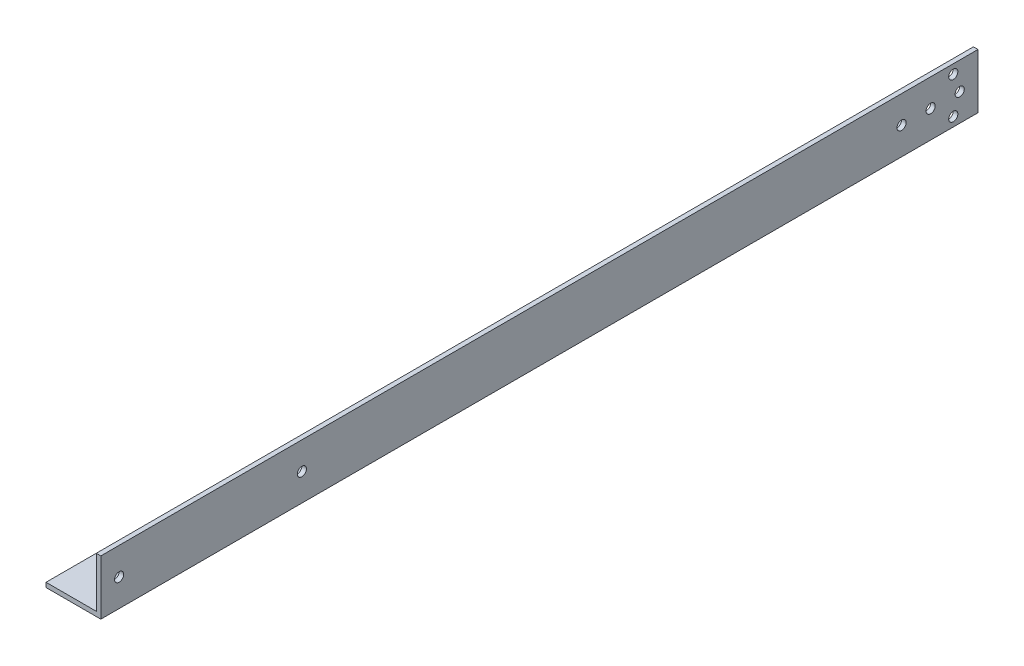
ISO-10303-21;
HEADER;
FILE_DESCRIPTION(('STEP AP214'),'2;1');
FILE_NAME('part.step','',(''),(''),'','','');
FILE_SCHEMA(('AUTOMOTIVE_DESIGN { 1 0 10303 214 1 1 1 1 }'));
ENDSEC;
DATA;
#1=APPLICATION_CONTEXT('core data for automotive mechanical design processes');
#2=APPLICATION_PROTOCOL_DEFINITION('international standard','automotive_design',2000,#1);
#3=PRODUCT_CONTEXT('',#1,'mechanical');
#4=PRODUCT('Part','Part','',(#3));
#5=PRODUCT_RELATED_PRODUCT_CATEGORY('part','',(#4));
#6=PRODUCT_DEFINITION_FORMATION('','',#4);
#7=PRODUCT_DEFINITION_CONTEXT('part definition',#1,'design');
#8=PRODUCT_DEFINITION('design','',#6,#7);
#9=PRODUCT_DEFINITION_SHAPE('','',#8);
#10=(LENGTH_UNIT() NAMED_UNIT(*) SI_UNIT(.MILLI.,.METRE.));
#11=(NAMED_UNIT(*) PLANE_ANGLE_UNIT() SI_UNIT($,.RADIAN.));
#12=(NAMED_UNIT(*) SI_UNIT($,.STERADIAN.) SOLID_ANGLE_UNIT());
#13=UNCERTAINTY_MEASURE_WITH_UNIT(LENGTH_MEASURE(1.E-05),#10,'distance_accuracy_value','');
#14=(GEOMETRIC_REPRESENTATION_CONTEXT(3) GLOBAL_UNCERTAINTY_ASSIGNED_CONTEXT((#13)) GLOBAL_UNIT_ASSIGNED_CONTEXT((#10,
#11,#12)) REPRESENTATION_CONTEXT('',''));
#15=CARTESIAN_POINT('',(0.,0.,0.));
#16=DIRECTION('',(0.,0.,1.));
#17=DIRECTION('',(1.,0.,0.));
#18=AXIS2_PLACEMENT_3D('',#15,#16,#17);
#19=CARTESIAN_POINT('',(-19.05,0.,304.8));
#20=DIRECTION('',(0.,1.,0.));
#21=DIRECTION('',(0.,0.,1.));
#22=AXIS2_PLACEMENT_3D('',#19,#20,#21);
#23=PLANE('',#22);
#24=DIRECTION('',(0.,0.,1.));
#25=VECTOR('',#24,1.);
#26=CARTESIAN_POINT('',(-1.5875,0.,0.));
#27=LINE('',#26,#25);
#28=CARTESIAN_POINT('',(-1.5875,0.,0.));
#29=VERTEX_POINT('',#28);
#30=CARTESIAN_POINT('',(-1.5875,0.,11.7700640302674));
#31=VERTEX_POINT('',#30);
#32=EDGE_CURVE('E182',#29,#31,#27,.T.);
#33=ORIENTED_EDGE('',*,*,#32,.F.);
#34=DIRECTION('',(1.,0.,0.));
#35=VECTOR('',#34,1.);
#36=CARTESIAN_POINT('',(-19.05,0.,0.));
#37=LINE('',#36,#35);
#38=CARTESIAN_POINT('',(0.,0.,0.));
#39=VERTEX_POINT('',#38);
#40=EDGE_CURVE('E117',#29,#39,#37,.T.);
#41=ORIENTED_EDGE('',*,*,#40,.T.);
#42=DIRECTION('',(0.,0.,-1.));
#43=VECTOR('',#42,1.);
#44=CARTESIAN_POINT('',(0.,0.,304.8));
#45=LINE('',#44,#43);
#46=CARTESIAN_POINT('',(0.,0.,304.8));
#47=VERTEX_POINT('',#46);
#48=EDGE_CURVE('E11',#47,#39,#45,.T.);
#49=ORIENTED_EDGE('',*,*,#48,.F.);
#50=DIRECTION('',(1.,0.,0.));
#51=VECTOR('',#50,1.);
#52=CARTESIAN_POINT('',(-19.05,0.,304.8));
#53=LINE('',#52,#51);
#54=CARTESIAN_POINT('',(-19.05,0.,304.8));
#55=VERTEX_POINT('',#54);
#56=EDGE_CURVE('E125',#55,#47,#53,.T.);
#57=ORIENTED_EDGE('',*,*,#56,.F.);
#58=DIRECTION('',(0.,0.,-1.));
#59=VECTOR('',#58,1.);
#60=CARTESIAN_POINT('',(-19.05,0.,304.8));
#61=LINE('',#60,#59);
#62=CARTESIAN_POINT('',(-19.05,0.,11.7700640302674));
#63=VERTEX_POINT('',#62);
#64=EDGE_CURVE('E113',#55,#63,#61,.T.);
#65=ORIENTED_EDGE('',*,*,#64,.T.);
#66=DIRECTION('',(-1.,0.,0.));
#67=VECTOR('',#66,1.);
#68=CARTESIAN_POINT('',(-1.5875,0.,11.7700640302674));
#69=LINE('',#68,#67);
#70=EDGE_CURVE('E184',#31,#63,#69,.T.);
#71=ORIENTED_EDGE('',*,*,#70,.F.);
#72=EDGE_LOOP('',(#33,#41,#49,#57,#65,#71));
#73=FACE_BOUND('',#72,.T.);
#74=ADVANCED_FACE('F31',(#73),#23,.F.);
#75=CARTESIAN_POINT('',(-1.5875,1.5875,304.8));
#76=DIRECTION('',(0.,-1.,0.));
#77=DIRECTION('',(1.,0.,0.));
#78=AXIS2_PLACEMENT_3D('',#75,#76,#77);
#79=PLANE('',#78);
#80=DIRECTION('',(-1.,0.,0.));
#81=VECTOR('',#80,1.);
#82=CARTESIAN_POINT('',(-1.5875,1.5875,11.7700640302674));
#83=LINE('',#82,#81);
#84=CARTESIAN_POINT('',(-1.5875,1.5875,11.7700640302674));
#85=VERTEX_POINT('',#84);
#86=CARTESIAN_POINT('',(-19.05,1.5875,11.7700640302674));
#87=VERTEX_POINT('',#86);
#88=EDGE_CURVE('E189',#85,#87,#83,.T.);
#89=ORIENTED_EDGE('',*,*,#88,.T.);
#90=DIRECTION('',(0.,0.,-1.));
#91=VECTOR('',#90,1.);
#92=CARTESIAN_POINT('',(-19.05,1.5875,304.8));
#93=LINE('',#92,#91);
#94=CARTESIAN_POINT('',(-19.05,1.5875,304.8));
#95=VERTEX_POINT('',#94);
#96=EDGE_CURVE('E108',#95,#87,#93,.T.);
#97=ORIENTED_EDGE('',*,*,#96,.F.);
#98=DIRECTION('',(-1.,0.,0.));
#99=VECTOR('',#98,1.);
#100=CARTESIAN_POINT('',(-1.5875,1.5875,304.8));
#101=LINE('',#100,#99);
#102=CARTESIAN_POINT('',(-1.5875,1.5875,304.8));
#103=VERTEX_POINT('',#102);
#104=EDGE_CURVE('E90',#103,#95,#101,.T.);
#105=ORIENTED_EDGE('',*,*,#104,.F.);
#106=DIRECTION('',(0.,0.,-1.));
#107=VECTOR('',#106,1.);
#108=CARTESIAN_POINT('',(-1.5875,1.5875,304.8));
#109=LINE('',#108,#107);
#110=EDGE_CURVE('E98',#103,#85,#109,.T.);
#111=ORIENTED_EDGE('',*,*,#110,.T.);
#112=EDGE_LOOP('',(#89,#97,#105,#111));
#113=FACE_BOUND('',#112,.T.);
#114=ADVANCED_FACE('F110',(#113),#79,.F.);
#115=CARTESIAN_POINT('',(-19.05,1.5875,304.8));
#116=DIRECTION('',(1.,0.,0.));
#117=DIRECTION('',(0.,0.,-1.));
#118=AXIS2_PLACEMENT_3D('',#115,#116,#117);
#119=PLANE('',#118);
#120=DIRECTION('',(0.,1.,0.));
#121=VECTOR('',#120,1.);
#122=CARTESIAN_POINT('',(-19.05,0.,11.7700640302674));
#123=LINE('',#122,#121);
#124=EDGE_CURVE('E185',#63,#87,#123,.T.);
#125=ORIENTED_EDGE('',*,*,#124,.F.);
#126=ORIENTED_EDGE('',*,*,#64,.F.);
#127=DIRECTION('',(0.,-1.,0.));
#128=VECTOR('',#127,1.);
#129=CARTESIAN_POINT('',(-19.05,1.5875,304.8));
#130=LINE('',#129,#128);
#131=EDGE_CURVE('E49',#95,#55,#130,.T.);
#132=ORIENTED_EDGE('',*,*,#131,.F.);
#133=ORIENTED_EDGE('',*,*,#96,.T.);
#134=EDGE_LOOP('',(#125,#126,#132,#133));
#135=FACE_BOUND('',#134,.T.);
#136=ADVANCED_FACE('F222',(#135),#119,.F.);
#137=CARTESIAN_POINT('',(0.,0.,0.));
#138=DIRECTION('',(0.,0.,1.));
#139=DIRECTION('',(1.,0.,0.));
#140=AXIS2_PLACEMENT_3D('',#137,#138,#139);
#141=PLANE('',#140);
#142=ORIENTED_EDGE('',*,*,#40,.F.);
#143=DIRECTION('',(0.,-1.,0.));
#144=VECTOR('',#143,1.);
#145=CARTESIAN_POINT('',(-1.5875,19.05,0.));
#146=LINE('',#145,#144);
#147=CARTESIAN_POINT('',(-1.5875,19.05,0.));
#148=VERTEX_POINT('',#147);
#149=EDGE_CURVE('E122',#148,#29,#146,.T.);
#150=ORIENTED_EDGE('',*,*,#149,.F.);
#151=DIRECTION('',(-1.,0.,0.));
#152=VECTOR('',#151,1.);
#153=CARTESIAN_POINT('',(0.,19.05,0.));
#154=LINE('',#153,#152);
#155=CARTESIAN_POINT('',(0.,19.05,0.));
#156=VERTEX_POINT('',#155);
#157=EDGE_CURVE('E70',#156,#148,#154,.T.);
#158=ORIENTED_EDGE('',*,*,#157,.F.);
#159=DIRECTION('',(0.,1.,0.));
#160=VECTOR('',#159,1.);
#161=CARTESIAN_POINT('',(0.,0.,0.));
#162=LINE('',#161,#160);
#163=EDGE_CURVE('E63',#39,#156,#162,.T.);
#164=ORIENTED_EDGE('',*,*,#163,.F.);
#165=EDGE_LOOP('',(#142,#150,#158,#164));
#166=FACE_BOUND('',#165,.T.);
#167=ADVANCED_FACE('F177',(#166),#141,.F.);
#168=CARTESIAN_POINT('',(0.,0.,304.8));
#169=DIRECTION('',(-1.,0.,0.));
#170=DIRECTION('',(0.,0.,1.));
#171=AXIS2_PLACEMENT_3D('',#168,#169,#170);
#172=PLANE('',#171);
#173=CARTESIAN_POINT('',(0.,9.525,6.35));
#174=DIRECTION('',(1.,0.,0.));
#175=DIRECTION('',(0.,0.,-1.));
#176=AXIS2_PLACEMENT_3D('',#173,#174,#175);
#177=CIRCLE('',#176,1.5875);
#178=CARTESIAN_POINT('',(0.,9.525,4.7625));
#179=VERTEX_POINT('',#178);
#180=EDGE_CURVE('E193',#179,#179,#177,.T.);
#181=ORIENTED_EDGE('',*,*,#180,.F.);
#182=EDGE_LOOP('',(#181));
#183=FACE_BOUND('',#182,.T.);
#184=CARTESIAN_POINT('',(0.,3.175,8.59506403026729));
#185=DIRECTION('',(1.,0.,0.));
#186=DIRECTION('',(0.,0.,-1.));
#187=AXIS2_PLACEMENT_3D('',#184,#185,#186);
#188=CIRCLE('',#187,1.5875);
#189=CARTESIAN_POINT('',(0.,3.175,7.00756403026729));
#190=VERTEX_POINT('',#189);
#191=EDGE_CURVE('E152',#190,#190,#188,.T.);
#192=ORIENTED_EDGE('',*,*,#191,.F.);
#193=EDGE_LOOP('',(#192));
#194=FACE_BOUND('',#193,.T.);
#195=CARTESIAN_POINT('',(0.,15.875,8.59506403026729));
#196=DIRECTION('',(1.,0.,0.));
#197=DIRECTION('',(0.,0.,-1.));
#198=AXIS2_PLACEMENT_3D('',#195,#196,#197);
#199=CIRCLE('',#198,1.5875);
#200=CARTESIAN_POINT('',(0.,15.875,7.00756403026729));
#201=VERTEX_POINT('',#200);
#202=EDGE_CURVE('E141',#201,#201,#199,.T.);
#203=ORIENTED_EDGE('',*,*,#202,.F.);
#204=EDGE_LOOP('',(#203));
#205=FACE_BOUND('',#204,.T.);
#206=CARTESIAN_POINT('',(0.,9.525,26.5555762724056));
#207=DIRECTION('',(1.,0.,0.));
#208=DIRECTION('',(0.,0.,-1.));
#209=AXIS2_PLACEMENT_3D('',#206,#207,#208);
#210=CIRCLE('',#209,1.5875);
#211=CARTESIAN_POINT('',(0.,9.525,24.9680762724056));
#212=VERTEX_POINT('',#211);
#213=EDGE_CURVE('E138',#212,#212,#210,.T.);
#214=ORIENTED_EDGE('',*,*,#213,.F.);
#215=EDGE_LOOP('',(#214));
#216=FACE_BOUND('',#215,.T.);
#217=CARTESIAN_POINT('',(0.,9.525,16.4527881362028));
#218=DIRECTION('',(1.,0.,0.));
#219=DIRECTION('',(0.,0.,-1.));
#220=AXIS2_PLACEMENT_3D('',#217,#218,#219);
#221=CIRCLE('',#220,1.5875);
#222=CARTESIAN_POINT('',(0.,9.525,14.8652881362028));
#223=VERTEX_POINT('',#222);
#224=EDGE_CURVE('E135',#223,#223,#221,.T.);
#225=ORIENTED_EDGE('',*,*,#224,.F.);
#226=EDGE_LOOP('',(#225));
#227=FACE_BOUND('',#226,.T.);
#228=CARTESIAN_POINT('',(0.,9.525,234.95));
#229=DIRECTION('',(1.,0.,0.));
#230=DIRECTION('',(0.,0.,-1.));
#231=AXIS2_PLACEMENT_3D('',#228,#229,#230);
#232=CIRCLE('',#231,1.58750000000004);
#233=CARTESIAN_POINT('',(0.,9.525,233.3625));
#234=VERTEX_POINT('',#233);
#235=EDGE_CURVE('E134',#234,#234,#232,.T.);
#236=ORIENTED_EDGE('',*,*,#235,.F.);
#237=EDGE_LOOP('',(#236));
#238=FACE_BOUND('',#237,.T.);
#239=CARTESIAN_POINT('',(0.,9.525,298.45));
#240=DIRECTION('',(1.,0.,0.));
#241=DIRECTION('',(0.,0.,-1.));
#242=AXIS2_PLACEMENT_3D('',#239,#240,#241);
#243=CIRCLE('',#242,1.58750000000004);
#244=CARTESIAN_POINT('',(0.,9.525,296.8625));
#245=VERTEX_POINT('',#244);
#246=EDGE_CURVE('E163',#245,#245,#243,.T.);
#247=ORIENTED_EDGE('',*,*,#246,.F.);
#248=EDGE_LOOP('',(#247));
#249=FACE_BOUND('',#248,.T.);
#250=ORIENTED_EDGE('',*,*,#163,.T.);
#251=DIRECTION('',(0.,0.,-1.));
#252=VECTOR('',#251,1.);
#253=CARTESIAN_POINT('',(0.,19.05,304.8));
#254=LINE('',#253,#252);
#255=CARTESIAN_POINT('',(0.,19.05,304.8));
#256=VERTEX_POINT('',#255);
#257=EDGE_CURVE('E40',#256,#156,#254,.T.);
#258=ORIENTED_EDGE('',*,*,#257,.F.);
#259=DIRECTION('',(0.,1.,0.));
#260=VECTOR('',#259,1.);
#261=CARTESIAN_POINT('',(0.,0.,304.8));
#262=LINE('',#261,#260);
#263=EDGE_CURVE('E76',#47,#256,#262,.T.);
#264=ORIENTED_EDGE('',*,*,#263,.F.);
#265=ORIENTED_EDGE('',*,*,#48,.T.);
#266=EDGE_LOOP('',(#250,#258,#264,#265));
#267=FACE_BOUND('',#266,.T.);
#268=ADVANCED_FACE('F171',(#183,#194,#205,#216,#227,#238,#249,#267),#172,.F.);
#269=CARTESIAN_POINT('',(0.,19.05,304.8));
#270=DIRECTION('',(0.,-1.,0.));
#271=DIRECTION('',(0.,0.,-1.));
#272=AXIS2_PLACEMENT_3D('',#269,#270,#271);
#273=PLANE('',#272);
#274=ORIENTED_EDGE('',*,*,#157,.T.);
#275=DIRECTION('',(0.,0.,-1.));
#276=VECTOR('',#275,1.);
#277=CARTESIAN_POINT('',(-1.5875,19.05,304.8));
#278=LINE('',#277,#276);
#279=CARTESIAN_POINT('',(-1.5875,19.05,304.8));
#280=VERTEX_POINT('',#279);
#281=EDGE_CURVE('E107',#280,#148,#278,.T.);
#282=ORIENTED_EDGE('',*,*,#281,.F.);
#283=DIRECTION('',(-1.,0.,0.));
#284=VECTOR('',#283,1.);
#285=CARTESIAN_POINT('',(0.,19.05,304.8));
#286=LINE('',#285,#284);
#287=EDGE_CURVE('E93',#256,#280,#286,.T.);
#288=ORIENTED_EDGE('',*,*,#287,.F.);
#289=ORIENTED_EDGE('',*,*,#257,.T.);
#290=EDGE_LOOP('',(#274,#282,#288,#289));
#291=FACE_BOUND('',#290,.T.);
#292=ADVANCED_FACE('F172',(#291),#273,.F.);
#293=CARTESIAN_POINT('',(-1.5875,19.05,304.8));
#294=DIRECTION('',(1.,0.,0.));
#295=DIRECTION('',(0.,1.,0.));
#296=AXIS2_PLACEMENT_3D('',#293,#294,#295);
#297=PLANE('',#296);
#298=DIRECTION('',(0.,1.,0.));
#299=VECTOR('',#298,1.);
#300=CARTESIAN_POINT('',(-1.5875,0.,11.7700640302674));
#301=LINE('',#300,#299);
#302=EDGE_CURVE('E103',#31,#85,#301,.T.);
#303=ORIENTED_EDGE('',*,*,#302,.T.);
#304=ORIENTED_EDGE('',*,*,#110,.F.);
#305=DIRECTION('',(0.,-1.,0.));
#306=VECTOR('',#305,1.);
#307=CARTESIAN_POINT('',(-1.5875,19.05,304.8));
#308=LINE('',#307,#306);
#309=EDGE_CURVE('E86',#280,#103,#308,.T.);
#310=ORIENTED_EDGE('',*,*,#309,.F.);
#311=ORIENTED_EDGE('',*,*,#281,.T.);
#312=ORIENTED_EDGE('',*,*,#149,.T.);
#313=ORIENTED_EDGE('',*,*,#32,.T.);
#314=EDGE_LOOP('',(#303,#304,#310,#311,#312,#313));
#315=FACE_BOUND('',#314,.T.);
#316=CARTESIAN_POINT('',(-1.5875,9.525,6.35));
#317=DIRECTION('',(1.,0.,0.));
#318=DIRECTION('',(0.,1.,0.));
#319=AXIS2_PLACEMENT_3D('',#316,#317,#318);
#320=CIRCLE('',#319,1.5875);
#321=CARTESIAN_POINT('',(-1.58750000000001,9.525,4.7625));
#322=VERTEX_POINT('',#321);
#323=EDGE_CURVE('E34',#322,#322,#320,.T.);
#324=ORIENTED_EDGE('',*,*,#323,.T.);
#325=EDGE_LOOP('',(#324));
#326=FACE_BOUND('',#325,.T.);
#327=CARTESIAN_POINT('',(-1.5875,15.875,8.59506403026729));
#328=DIRECTION('',(1.,0.,0.));
#329=DIRECTION('',(0.,1.,0.));
#330=AXIS2_PLACEMENT_3D('',#327,#328,#329);
#331=CIRCLE('',#330,1.5875);
#332=CARTESIAN_POINT('',(-1.58750000000001,15.875,7.00756403026729));
#333=VERTEX_POINT('',#332);
#334=EDGE_CURVE('E139',#333,#333,#331,.T.);
#335=ORIENTED_EDGE('',*,*,#334,.T.);
#336=EDGE_LOOP('',(#335));
#337=FACE_BOUND('',#336,.T.);
#338=CARTESIAN_POINT('',(-1.5875,9.525,26.5555762724056));
#339=DIRECTION('',(1.,0.,0.));
#340=DIRECTION('',(0.,1.,0.));
#341=AXIS2_PLACEMENT_3D('',#338,#339,#340);
#342=CIRCLE('',#341,1.5875);
#343=CARTESIAN_POINT('',(-1.58750000000001,9.525,24.9680762724056));
#344=VERTEX_POINT('',#343);
#345=EDGE_CURVE('E136',#344,#344,#342,.T.);
#346=ORIENTED_EDGE('',*,*,#345,.T.);
#347=EDGE_LOOP('',(#346));
#348=FACE_BOUND('',#347,.T.);
#349=CARTESIAN_POINT('',(-1.5875,9.525,16.4527881362028));
#350=DIRECTION('',(1.,0.,0.));
#351=DIRECTION('',(0.,1.,0.));
#352=AXIS2_PLACEMENT_3D('',#349,#350,#351);
#353=CIRCLE('',#352,1.5875);
#354=CARTESIAN_POINT('',(-1.58750000000001,9.525,14.8652881362028));
#355=VERTEX_POINT('',#354);
#356=EDGE_CURVE('E131',#355,#355,#353,.T.);
#357=ORIENTED_EDGE('',*,*,#356,.T.);
#358=EDGE_LOOP('',(#357));
#359=FACE_BOUND('',#358,.T.);
#360=CARTESIAN_POINT('',(-1.5875,9.525,234.95));
#361=DIRECTION('',(1.,0.,0.));
#362=DIRECTION('',(0.,1.,0.));
#363=AXIS2_PLACEMENT_3D('',#360,#361,#362);
#364=CIRCLE('',#363,1.58750000000004);
#365=CARTESIAN_POINT('',(-1.5875,11.1125,234.95));
#366=VERTEX_POINT('',#365);
#367=EDGE_CURVE('E160',#366,#366,#364,.F.);
#368=ORIENTED_EDGE('',*,*,#367,.F.);
#369=EDGE_LOOP('',(#368));
#370=FACE_BOUND('',#369,.T.);
#371=CARTESIAN_POINT('',(-1.5875,9.525,298.45));
#372=DIRECTION('',(1.,0.,0.));
#373=DIRECTION('',(0.,1.,0.));
#374=AXIS2_PLACEMENT_3D('',#371,#372,#373);
#375=CIRCLE('',#374,1.58750000000004);
#376=CARTESIAN_POINT('',(-1.5875,11.1125,298.45));
#377=VERTEX_POINT('',#376);
#378=EDGE_CURVE('E119',#377,#377,#375,.F.);
#379=ORIENTED_EDGE('',*,*,#378,.F.);
#380=EDGE_LOOP('',(#379));
#381=FACE_BOUND('',#380,.T.);
#382=CARTESIAN_POINT('',(-1.5875,3.175,8.59506403026729));
#383=DIRECTION('',(1.,0.,0.));
#384=DIRECTION('',(0.,1.,0.));
#385=AXIS2_PLACEMENT_3D('',#382,#383,#384);
#386=CIRCLE('',#385,1.5875);
#387=CARTESIAN_POINT('',(-1.58750000000001,3.175,7.00756403026729));
#388=VERTEX_POINT('',#387);
#389=EDGE_CURVE('E147',#388,#388,#386,.T.);
#390=ORIENTED_EDGE('',*,*,#389,.T.);
#391=EDGE_LOOP('',(#390));
#392=FACE_BOUND('',#391,.T.);
#393=ADVANCED_FACE('F99',(#315,#326,#337,#348,#359,#370,#381,#392),#297,.F.);
#394=CARTESIAN_POINT('',(0.,0.,304.8));
#395=DIRECTION('',(0.,0.,1.));
#396=DIRECTION('',(1.,0.,0.));
#397=AXIS2_PLACEMENT_3D('',#394,#395,#396);
#398=PLANE('',#397);
#399=ORIENTED_EDGE('',*,*,#56,.T.);
#400=ORIENTED_EDGE('',*,*,#263,.T.);
#401=ORIENTED_EDGE('',*,*,#287,.T.);
#402=ORIENTED_EDGE('',*,*,#309,.T.);
#403=ORIENTED_EDGE('',*,*,#104,.T.);
#404=ORIENTED_EDGE('',*,*,#131,.T.);
#405=EDGE_LOOP('',(#399,#400,#401,#402,#403,#404));
#406=FACE_BOUND('',#405,.T.);
#407=ADVANCED_FACE('F88',(#406),#398,.T.);
#408=CARTESIAN_POINT('',(-6.0776280605347,9.525,298.45));
#409=DIRECTION('',(1.,0.,0.));
#410=DIRECTION('',(0.,0.,-1.));
#411=AXIS2_PLACEMENT_3D('',#408,#409,#410);
#412=CYLINDRICAL_SURFACE('',#411,1.58750000000004);
#413=ORIENTED_EDGE('',*,*,#378,.T.);
#414=EDGE_LOOP('',(#413));
#415=FACE_BOUND('',#414,.T.);
#416=ORIENTED_EDGE('',*,*,#246,.T.);
#417=EDGE_LOOP('',(#416));
#418=FACE_BOUND('',#417,.T.);
#419=ADVANCED_FACE('F251',(#415,#418),#412,.F.);
#420=CARTESIAN_POINT('',(-6.0776280605347,9.525,234.95));
#421=DIRECTION('',(1.,0.,0.));
#422=DIRECTION('',(0.,0.,-1.));
#423=AXIS2_PLACEMENT_3D('',#420,#421,#422);
#424=CYLINDRICAL_SURFACE('',#423,1.58750000000004);
#425=ORIENTED_EDGE('',*,*,#367,.T.);
#426=EDGE_LOOP('',(#425));
#427=FACE_BOUND('',#426,.T.);
#428=ORIENTED_EDGE('',*,*,#235,.T.);
#429=EDGE_LOOP('',(#428));
#430=FACE_BOUND('',#429,.T.);
#431=ADVANCED_FACE('F253',(#427,#430),#424,.F.);
#432=CARTESIAN_POINT('',(-19.05,9.525,16.4527881362028));
#433=DIRECTION('',(1.,0.,0.));
#434=DIRECTION('',(0.,0.,-1.));
#435=AXIS2_PLACEMENT_3D('',#432,#433,#434);
#436=CYLINDRICAL_SURFACE('',#435,1.5875);
#437=CARTESIAN_POINT('',(0.,9.525,14.8652881362028));
#438=CARTESIAN_POINT('',(-0.016536458333333,9.525,14.8652881362028));
#439=CARTESIAN_POINT('',(-0.0330729166666659,9.525,14.8652881362028));
#440=CARTESIAN_POINT('',(-0.066145833333333,9.525,14.8652881362028));
#441=CARTESIAN_POINT('',(-0.0826822916666671,9.525,14.8652881362028));
#442=CARTESIAN_POINT('',(-0.115755208333334,9.525,14.8652881362028));
#443=CARTESIAN_POINT('',(-0.132291666666667,9.525,14.8652881362028));
#444=CARTESIAN_POINT('',(-0.165364583333334,9.525,14.8652881362028));
#445=CARTESIAN_POINT('',(-0.181901041666668,9.525,14.8652881362028));
#446=CARTESIAN_POINT('',(-0.214973958333335,9.525,14.8652881362028));
#447=CARTESIAN_POINT('',(-0.231510416666668,9.525,14.8652881362028));
#448=CARTESIAN_POINT('',(-0.264583333333334,9.525,14.8652881362028));
#449=CARTESIAN_POINT('',(-0.281119791666667,9.525,14.8652881362028));
#450=CARTESIAN_POINT('',(-0.314192708333334,9.525,14.8652881362028));
#451=CARTESIAN_POINT('',(-0.330729166666668,9.525,14.8652881362028));
#452=CARTESIAN_POINT('',(-0.363802083333335,9.525,14.8652881362028));
#453=CARTESIAN_POINT('',(-0.380338541666668,9.525,14.8652881362028));
#454=CARTESIAN_POINT('',(-0.413411458333334,9.525,14.8652881362028));
#455=CARTESIAN_POINT('',(-0.429947916666667,9.525,14.8652881362028));
#456=CARTESIAN_POINT('',(-0.463020833333334,9.525,14.8652881362028));
#457=CARTESIAN_POINT('',(-0.479557291666668,9.525,14.8652881362028));
#458=CARTESIAN_POINT('',(-0.512630208333336,9.525,14.8652881362028));
#459=CARTESIAN_POINT('',(-0.529166666666669,9.525,14.8652881362028));
#460=CARTESIAN_POINT('',(-0.562239583333334,9.525,14.8652881362028));
#461=CARTESIAN_POINT('',(-0.578776041666667,9.525,14.8652881362028));
#462=CARTESIAN_POINT('',(-0.611848958333334,9.525,14.8652881362028));
#463=CARTESIAN_POINT('',(-0.628385416666669,9.525,14.8652881362028));
#464=CARTESIAN_POINT('',(-0.661458333333336,9.525,14.8652881362028));
#465=CARTESIAN_POINT('',(-0.677994791666669,9.525,14.8652881362028));
#466=CARTESIAN_POINT('',(-0.711067708333336,9.525,14.8652881362028));
#467=CARTESIAN_POINT('',(-0.72760416666667,9.525,14.8652881362028));
#468=CARTESIAN_POINT('',(-0.760677083333337,9.525,14.8652881362028));
#469=CARTESIAN_POINT('',(-0.77721354166667,9.525,14.8652881362028));
#470=CARTESIAN_POINT('',(-0.810286458333336,9.525,14.8652881362028));
#471=CARTESIAN_POINT('',(-0.826822916666669,9.525,14.8652881362028));
#472=CARTESIAN_POINT('',(-0.859895833333336,9.525,14.8652881362028));
#473=CARTESIAN_POINT('',(-0.87643229166667,9.525,14.8652881362028));
#474=CARTESIAN_POINT('',(-0.909505208333337,9.525,14.8652881362028));
#475=CARTESIAN_POINT('',(-0.92604166666667,9.525,14.8652881362028));
#476=CARTESIAN_POINT('',(-0.959114583333337,9.525,14.8652881362028));
#477=CARTESIAN_POINT('',(-0.975651041666671,9.525,14.8652881362028));
#478=CARTESIAN_POINT('',(-1.00872395833334,9.525,14.8652881362028));
#479=CARTESIAN_POINT('',(-1.02526041666667,9.525,14.8652881362028));
#480=CARTESIAN_POINT('',(-1.05833333333334,9.525,14.8652881362028));
#481=CARTESIAN_POINT('',(-1.07486979166667,9.525,14.8652881362028));
#482=CARTESIAN_POINT('',(-1.10794270833334,9.525,14.8652881362028));
#483=CARTESIAN_POINT('',(-1.12447916666667,9.525,14.8652881362028));
#484=CARTESIAN_POINT('',(-1.15755208333334,9.525,14.8652881362028));
#485=CARTESIAN_POINT('',(-1.17408854166667,9.525,14.8652881362028));
#486=CARTESIAN_POINT('',(-1.20716145833334,9.525,14.8652881362028));
#487=CARTESIAN_POINT('',(-1.22369791666667,9.525,14.8652881362028));
#488=CARTESIAN_POINT('',(-1.25677083333334,9.525,14.8652881362028));
#489=CARTESIAN_POINT('',(-1.27330729166667,9.525,14.8652881362028));
#490=CARTESIAN_POINT('',(-1.30638020833334,9.525,14.8652881362028));
#491=CARTESIAN_POINT('',(-1.32291666666667,9.525,14.8652881362028));
#492=CARTESIAN_POINT('',(-1.35598958333334,9.525,14.8652881362028));
#493=CARTESIAN_POINT('',(-1.37252604166667,9.525,14.8652881362028));
#494=CARTESIAN_POINT('',(-1.40559895833334,9.525,14.8652881362028));
#495=CARTESIAN_POINT('',(-1.42213541666667,9.525,14.8652881362028));
#496=CARTESIAN_POINT('',(-1.45520833333334,9.525,14.8652881362028));
#497=CARTESIAN_POINT('',(-1.47174479166667,9.525,14.8652881362028));
#498=CARTESIAN_POINT('',(-1.50481770833334,9.525,14.8652881362028));
#499=CARTESIAN_POINT('',(-1.52135416666667,9.525,14.8652881362028));
#500=CARTESIAN_POINT('',(-1.55442708333334,9.525,14.8652881362028));
#501=CARTESIAN_POINT('',(-1.57096354166667,9.525,14.8652881362028));
#502=CARTESIAN_POINT('',(-1.58750000000001,9.525,14.8652881362028));
#503=B_SPLINE_CURVE_WITH_KNOTS('',3,(#437,#438,#439,#440,#441,#442,#443,#444,#445,#446,#447,
#448,#449,#450,#451,#452,#453,#454,#455,#456,#457,#458,#459,#460,#461,#462,#463,#464,#465,#466,
#467,#468,#469,#470,#471,#472,#473,#474,#475,#476,#477,#478,#479,#480,#481,#482,#483,#484,#485,
#486,#487,#488,#489,#490,#491,#492,#493,#494,#495,#496,#497,#498,#499,#500,#501,#502),
.UNSPECIFIED.,.F.,.F.,(4,2,2,2,2,2,2,2,2,2,2,2,2,2,2,2,2,2,2,2,2,2,2,2,2,2,2,2,2,2,2,2,4),(0.,
0.0496093749999989,0.0992187500000012,0.148828125,0.198437500000002,0.248046875000001,
0.29765625,0.347265625000003,0.396875000000001,0.446484375,0.496093750000003,0.545703125000002,
0.5953125,0.644921875000003,0.694531250000002,0.744140625000004,0.793750000000003,
0.843359375000002,0.892968750000004,0.942578125000003,0.992187500000005,1.041796875,1.09140625,
1.14101562500001,1.190625,1.240234375,1.28984375000001,1.339453125,1.3890625,1.43867187500001,
1.48828125,1.53789062500001,1.58750000000001),.UNSPECIFIED.);
#504=EDGE_CURVE('BSEAM260',#223,#355,#503,.T.);
#505=ORIENTED_EDGE('',*,*,#224,.T.);
#506=ORIENTED_EDGE('',*,*,#356,.F.);
#507=ORIENTED_EDGE('',*,*,#504,.T.);
#508=ORIENTED_EDGE('',*,*,#504,.F.);
#509=EDGE_LOOP('',(#505,#507,#506,#508));
#510=FACE_BOUND('',#509,.T.);
#511=ADVANCED_FACE('F260',(#510),#436,.F.);
#512=CARTESIAN_POINT('',(-19.05,9.525,26.5555762724056));
#513=DIRECTION('',(1.,0.,0.));
#514=DIRECTION('',(0.,0.,-1.));
#515=AXIS2_PLACEMENT_3D('',#512,#513,#514);
#516=CYLINDRICAL_SURFACE('',#515,1.5875);
#517=CARTESIAN_POINT('',(0.,9.525,24.9680762724056));
#518=CARTESIAN_POINT('',(-0.016536458333333,9.525,24.9680762724056));
#519=CARTESIAN_POINT('',(-0.0330729166666659,9.525,24.9680762724056));
#520=CARTESIAN_POINT('',(-0.066145833333333,9.525,24.9680762724056));
#521=CARTESIAN_POINT('',(-0.0826822916666671,9.525,24.9680762724056));
#522=CARTESIAN_POINT('',(-0.115755208333334,9.525,24.9680762724056));
#523=CARTESIAN_POINT('',(-0.132291666666667,9.525,24.9680762724056));
#524=CARTESIAN_POINT('',(-0.165364583333334,9.525,24.9680762724056));
#525=CARTESIAN_POINT('',(-0.181901041666668,9.525,24.9680762724056));
#526=CARTESIAN_POINT('',(-0.214973958333335,9.525,24.9680762724056));
#527=CARTESIAN_POINT('',(-0.231510416666668,9.525,24.9680762724056));
#528=CARTESIAN_POINT('',(-0.264583333333334,9.525,24.9680762724056));
#529=CARTESIAN_POINT('',(-0.281119791666667,9.525,24.9680762724056));
#530=CARTESIAN_POINT('',(-0.314192708333334,9.525,24.9680762724056));
#531=CARTESIAN_POINT('',(-0.330729166666668,9.525,24.9680762724056));
#532=CARTESIAN_POINT('',(-0.363802083333335,9.525,24.9680762724056));
#533=CARTESIAN_POINT('',(-0.380338541666668,9.525,24.9680762724056));
#534=CARTESIAN_POINT('',(-0.413411458333334,9.525,24.9680762724056));
#535=CARTESIAN_POINT('',(-0.429947916666667,9.525,24.9680762724056));
#536=CARTESIAN_POINT('',(-0.463020833333334,9.525,24.9680762724056));
#537=CARTESIAN_POINT('',(-0.479557291666668,9.525,24.9680762724056));
#538=CARTESIAN_POINT('',(-0.512630208333336,9.525,24.9680762724056));
#539=CARTESIAN_POINT('',(-0.529166666666669,9.525,24.9680762724056));
#540=CARTESIAN_POINT('',(-0.562239583333334,9.525,24.9680762724056));
#541=CARTESIAN_POINT('',(-0.578776041666667,9.525,24.9680762724056));
#542=CARTESIAN_POINT('',(-0.611848958333334,9.525,24.9680762724056));
#543=CARTESIAN_POINT('',(-0.628385416666669,9.525,24.9680762724056));
#544=CARTESIAN_POINT('',(-0.661458333333336,9.525,24.9680762724056));
#545=CARTESIAN_POINT('',(-0.677994791666669,9.525,24.9680762724056));
#546=CARTESIAN_POINT('',(-0.711067708333336,9.525,24.9680762724056));
#547=CARTESIAN_POINT('',(-0.72760416666667,9.525,24.9680762724056));
#548=CARTESIAN_POINT('',(-0.760677083333337,9.525,24.9680762724056));
#549=CARTESIAN_POINT('',(-0.77721354166667,9.525,24.9680762724056));
#550=CARTESIAN_POINT('',(-0.810286458333336,9.525,24.9680762724056));
#551=CARTESIAN_POINT('',(-0.826822916666669,9.525,24.9680762724056));
#552=CARTESIAN_POINT('',(-0.859895833333336,9.525,24.9680762724056));
#553=CARTESIAN_POINT('',(-0.87643229166667,9.525,24.9680762724056));
#554=CARTESIAN_POINT('',(-0.909505208333337,9.525,24.9680762724056));
#555=CARTESIAN_POINT('',(-0.92604166666667,9.525,24.9680762724056));
#556=CARTESIAN_POINT('',(-0.959114583333337,9.525,24.9680762724056));
#557=CARTESIAN_POINT('',(-0.975651041666671,9.525,24.9680762724056));
#558=CARTESIAN_POINT('',(-1.00872395833334,9.525,24.9680762724056));
#559=CARTESIAN_POINT('',(-1.02526041666667,9.525,24.9680762724056));
#560=CARTESIAN_POINT('',(-1.05833333333334,9.525,24.9680762724056));
#561=CARTESIAN_POINT('',(-1.07486979166667,9.525,24.9680762724056));
#562=CARTESIAN_POINT('',(-1.10794270833334,9.525,24.9680762724056));
#563=CARTESIAN_POINT('',(-1.12447916666667,9.525,24.9680762724056));
#564=CARTESIAN_POINT('',(-1.15755208333334,9.525,24.9680762724056));
#565=CARTESIAN_POINT('',(-1.17408854166667,9.525,24.9680762724056));
#566=CARTESIAN_POINT('',(-1.20716145833334,9.525,24.9680762724056));
#567=CARTESIAN_POINT('',(-1.22369791666667,9.525,24.9680762724056));
#568=CARTESIAN_POINT('',(-1.25677083333334,9.525,24.9680762724056));
#569=CARTESIAN_POINT('',(-1.27330729166667,9.525,24.9680762724056));
#570=CARTESIAN_POINT('',(-1.30638020833334,9.525,24.9680762724056));
#571=CARTESIAN_POINT('',(-1.32291666666667,9.525,24.9680762724056));
#572=CARTESIAN_POINT('',(-1.35598958333334,9.525,24.9680762724056));
#573=CARTESIAN_POINT('',(-1.37252604166667,9.525,24.9680762724056));
#574=CARTESIAN_POINT('',(-1.40559895833334,9.525,24.9680762724056));
#575=CARTESIAN_POINT('',(-1.42213541666667,9.525,24.9680762724056));
#576=CARTESIAN_POINT('',(-1.45520833333334,9.525,24.9680762724056));
#577=CARTESIAN_POINT('',(-1.47174479166667,9.525,24.9680762724056));
#578=CARTESIAN_POINT('',(-1.50481770833334,9.525,24.9680762724056));
#579=CARTESIAN_POINT('',(-1.52135416666667,9.525,24.9680762724056));
#580=CARTESIAN_POINT('',(-1.55442708333334,9.525,24.9680762724056));
#581=CARTESIAN_POINT('',(-1.57096354166667,9.525,24.9680762724056));
#582=CARTESIAN_POINT('',(-1.58750000000001,9.525,24.9680762724056));
#583=B_SPLINE_CURVE_WITH_KNOTS('',3,(#517,#518,#519,#520,#521,#522,#523,#524,#525,#526,#527,
#528,#529,#530,#531,#532,#533,#534,#535,#536,#537,#538,#539,#540,#541,#542,#543,#544,#545,#546,
#547,#548,#549,#550,#551,#552,#553,#554,#555,#556,#557,#558,#559,#560,#561,#562,#563,#564,#565,
#566,#567,#568,#569,#570,#571,#572,#573,#574,#575,#576,#577,#578,#579,#580,#581,#582),
.UNSPECIFIED.,.F.,.F.,(4,2,2,2,2,2,2,2,2,2,2,2,2,2,2,2,2,2,2,2,2,2,2,2,2,2,2,2,2,2,2,2,4),(0.,
0.0496093749999989,0.0992187500000012,0.148828125,0.198437500000002,0.248046875000001,
0.29765625,0.347265625000003,0.396875000000001,0.446484375,0.496093750000003,0.545703125000002,
0.5953125,0.644921875000003,0.694531250000002,0.744140625000004,0.793750000000003,
0.843359375000002,0.892968750000004,0.942578125000003,0.992187500000005,1.041796875,1.09140625,
1.14101562500001,1.190625,1.240234375,1.28984375000001,1.339453125,1.3890625,1.43867187500001,
1.48828125,1.53789062500001,1.58750000000001),.UNSPECIFIED.);
#584=EDGE_CURVE('BSEAM267',#212,#344,#583,.T.);
#585=ORIENTED_EDGE('',*,*,#213,.T.);
#586=ORIENTED_EDGE('',*,*,#345,.F.);
#587=ORIENTED_EDGE('',*,*,#584,.T.);
#588=ORIENTED_EDGE('',*,*,#584,.F.);
#589=EDGE_LOOP('',(#585,#587,#586,#588));
#590=FACE_BOUND('',#589,.T.);
#591=ADVANCED_FACE('F267',(#590),#516,.F.);
#592=CARTESIAN_POINT('',(-19.05,15.875,8.59506403026729));
#593=DIRECTION('',(1.,0.,0.));
#594=DIRECTION('',(0.,0.,-1.));
#595=AXIS2_PLACEMENT_3D('',#592,#593,#594);
#596=CYLINDRICAL_SURFACE('',#595,1.5875);
#597=CARTESIAN_POINT('',(0.,15.875,7.00756403026729));
#598=CARTESIAN_POINT('',(-0.016536458333333,15.875,7.00756403026729));
#599=CARTESIAN_POINT('',(-0.0330729166666659,15.875,7.00756403026729));
#600=CARTESIAN_POINT('',(-0.066145833333333,15.875,7.00756403026729));
#601=CARTESIAN_POINT('',(-0.0826822916666671,15.875,7.00756403026729));
#602=CARTESIAN_POINT('',(-0.115755208333334,15.875,7.00756403026729));
#603=CARTESIAN_POINT('',(-0.132291666666667,15.875,7.00756403026729));
#604=CARTESIAN_POINT('',(-0.165364583333334,15.875,7.00756403026729));
#605=CARTESIAN_POINT('',(-0.181901041666668,15.875,7.00756403026729));
#606=CARTESIAN_POINT('',(-0.214973958333335,15.875,7.00756403026729));
#607=CARTESIAN_POINT('',(-0.231510416666668,15.875,7.00756403026729));
#608=CARTESIAN_POINT('',(-0.264583333333334,15.875,7.00756403026729));
#609=CARTESIAN_POINT('',(-0.281119791666667,15.875,7.00756403026729));
#610=CARTESIAN_POINT('',(-0.314192708333334,15.875,7.00756403026729));
#611=CARTESIAN_POINT('',(-0.330729166666668,15.875,7.00756403026729));
#612=CARTESIAN_POINT('',(-0.363802083333335,15.875,7.00756403026729));
#613=CARTESIAN_POINT('',(-0.380338541666668,15.875,7.00756403026729));
#614=CARTESIAN_POINT('',(-0.413411458333334,15.875,7.00756403026729));
#615=CARTESIAN_POINT('',(-0.429947916666667,15.875,7.00756403026729));
#616=CARTESIAN_POINT('',(-0.463020833333334,15.875,7.00756403026729));
#617=CARTESIAN_POINT('',(-0.479557291666668,15.875,7.00756403026729));
#618=CARTESIAN_POINT('',(-0.512630208333336,15.875,7.00756403026729));
#619=CARTESIAN_POINT('',(-0.529166666666669,15.875,7.00756403026729));
#620=CARTESIAN_POINT('',(-0.562239583333334,15.875,7.00756403026729));
#621=CARTESIAN_POINT('',(-0.578776041666667,15.875,7.00756403026729));
#622=CARTESIAN_POINT('',(-0.611848958333334,15.875,7.00756403026729));
#623=CARTESIAN_POINT('',(-0.628385416666669,15.875,7.00756403026729));
#624=CARTESIAN_POINT('',(-0.661458333333336,15.875,7.00756403026729));
#625=CARTESIAN_POINT('',(-0.677994791666669,15.875,7.00756403026729));
#626=CARTESIAN_POINT('',(-0.711067708333336,15.875,7.00756403026729));
#627=CARTESIAN_POINT('',(-0.72760416666667,15.875,7.00756403026729));
#628=CARTESIAN_POINT('',(-0.760677083333337,15.875,7.00756403026729));
#629=CARTESIAN_POINT('',(-0.77721354166667,15.875,7.00756403026729));
#630=CARTESIAN_POINT('',(-0.810286458333336,15.875,7.00756403026729));
#631=CARTESIAN_POINT('',(-0.826822916666669,15.875,7.00756403026729));
#632=CARTESIAN_POINT('',(-0.859895833333336,15.875,7.00756403026729));
#633=CARTESIAN_POINT('',(-0.87643229166667,15.875,7.00756403026729));
#634=CARTESIAN_POINT('',(-0.909505208333337,15.875,7.00756403026729));
#635=CARTESIAN_POINT('',(-0.92604166666667,15.875,7.00756403026729));
#636=CARTESIAN_POINT('',(-0.959114583333337,15.875,7.00756403026729));
#637=CARTESIAN_POINT('',(-0.975651041666671,15.875,7.00756403026729));
#638=CARTESIAN_POINT('',(-1.00872395833334,15.875,7.00756403026729));
#639=CARTESIAN_POINT('',(-1.02526041666667,15.875,7.00756403026729));
#640=CARTESIAN_POINT('',(-1.05833333333334,15.875,7.00756403026729));
#641=CARTESIAN_POINT('',(-1.07486979166667,15.875,7.00756403026729));
#642=CARTESIAN_POINT('',(-1.10794270833334,15.875,7.00756403026729));
#643=CARTESIAN_POINT('',(-1.12447916666667,15.875,7.00756403026729));
#644=CARTESIAN_POINT('',(-1.15755208333334,15.875,7.00756403026729));
#645=CARTESIAN_POINT('',(-1.17408854166667,15.875,7.00756403026729));
#646=CARTESIAN_POINT('',(-1.20716145833334,15.875,7.00756403026729));
#647=CARTESIAN_POINT('',(-1.22369791666667,15.875,7.00756403026729));
#648=CARTESIAN_POINT('',(-1.25677083333334,15.875,7.00756403026729));
#649=CARTESIAN_POINT('',(-1.27330729166667,15.875,7.00756403026729));
#650=CARTESIAN_POINT('',(-1.30638020833334,15.875,7.00756403026729));
#651=CARTESIAN_POINT('',(-1.32291666666667,15.875,7.00756403026729));
#652=CARTESIAN_POINT('',(-1.35598958333334,15.875,7.00756403026729));
#653=CARTESIAN_POINT('',(-1.37252604166667,15.875,7.00756403026729));
#654=CARTESIAN_POINT('',(-1.40559895833334,15.875,7.00756403026729));
#655=CARTESIAN_POINT('',(-1.42213541666667,15.875,7.00756403026729));
#656=CARTESIAN_POINT('',(-1.45520833333334,15.875,7.00756403026729));
#657=CARTESIAN_POINT('',(-1.47174479166667,15.875,7.00756403026729));
#658=CARTESIAN_POINT('',(-1.50481770833334,15.875,7.00756403026729));
#659=CARTESIAN_POINT('',(-1.52135416666667,15.875,7.00756403026729));
#660=CARTESIAN_POINT('',(-1.55442708333334,15.875,7.00756403026729));
#661=CARTESIAN_POINT('',(-1.57096354166667,15.875,7.00756403026729));
#662=CARTESIAN_POINT('',(-1.58750000000001,15.875,7.00756403026729));
#663=B_SPLINE_CURVE_WITH_KNOTS('',3,(#597,#598,#599,#600,#601,#602,#603,#604,#605,#606,#607,
#608,#609,#610,#611,#612,#613,#614,#615,#616,#617,#618,#619,#620,#621,#622,#623,#624,#625,#626,
#627,#628,#629,#630,#631,#632,#633,#634,#635,#636,#637,#638,#639,#640,#641,#642,#643,#644,#645,
#646,#647,#648,#649,#650,#651,#652,#653,#654,#655,#656,#657,#658,#659,#660,#661,#662),
.UNSPECIFIED.,.F.,.F.,(4,2,2,2,2,2,2,2,2,2,2,2,2,2,2,2,2,2,2,2,2,2,2,2,2,2,2,2,2,2,2,2,4),(0.,
0.0496093749999989,0.0992187500000012,0.148828125,0.198437500000002,0.248046875000001,
0.29765625,0.347265625000003,0.396875000000001,0.446484375,0.496093750000003,0.545703125000002,
0.5953125,0.644921875000003,0.694531250000002,0.744140625000004,0.793750000000003,
0.843359375000002,0.892968750000004,0.942578125000003,0.992187500000005,1.041796875,1.09140625,
1.14101562500001,1.190625,1.240234375,1.28984375000001,1.339453125,1.3890625,1.43867187500001,
1.48828125,1.53789062500001,1.58750000000001),.UNSPECIFIED.);
#664=EDGE_CURVE('BSEAM216',#201,#333,#663,.T.);
#665=ORIENTED_EDGE('',*,*,#202,.T.);
#666=ORIENTED_EDGE('',*,*,#334,.F.);
#667=ORIENTED_EDGE('',*,*,#664,.T.);
#668=ORIENTED_EDGE('',*,*,#664,.F.);
#669=EDGE_LOOP('',(#665,#667,#666,#668));
#670=FACE_BOUND('',#669,.T.);
#671=ADVANCED_FACE('F216',(#670),#596,.F.);
#672=CARTESIAN_POINT('',(-19.05,3.175,8.59506403026729));
#673=DIRECTION('',(1.,0.,0.));
#674=DIRECTION('',(0.,0.,-1.));
#675=AXIS2_PLACEMENT_3D('',#672,#673,#674);
#676=CYLINDRICAL_SURFACE('',#675,1.5875);
#677=CARTESIAN_POINT('',(0.,3.175,7.00756403026729));
#678=CARTESIAN_POINT('',(-0.016536458333333,3.175,7.00756403026729));
#679=CARTESIAN_POINT('',(-0.0330729166666659,3.175,7.00756403026729));
#680=CARTESIAN_POINT('',(-0.066145833333333,3.175,7.00756403026729));
#681=CARTESIAN_POINT('',(-0.0826822916666671,3.175,7.00756403026729));
#682=CARTESIAN_POINT('',(-0.115755208333334,3.175,7.00756403026729));
#683=CARTESIAN_POINT('',(-0.132291666666667,3.175,7.00756403026729));
#684=CARTESIAN_POINT('',(-0.165364583333334,3.175,7.00756403026729));
#685=CARTESIAN_POINT('',(-0.181901041666668,3.175,7.00756403026729));
#686=CARTESIAN_POINT('',(-0.214973958333335,3.175,7.00756403026729));
#687=CARTESIAN_POINT('',(-0.231510416666668,3.175,7.00756403026729));
#688=CARTESIAN_POINT('',(-0.264583333333334,3.175,7.00756403026729));
#689=CARTESIAN_POINT('',(-0.281119791666667,3.175,7.00756403026729));
#690=CARTESIAN_POINT('',(-0.314192708333334,3.175,7.00756403026729));
#691=CARTESIAN_POINT('',(-0.330729166666668,3.175,7.00756403026729));
#692=CARTESIAN_POINT('',(-0.363802083333335,3.175,7.00756403026729));
#693=CARTESIAN_POINT('',(-0.380338541666668,3.175,7.00756403026729));
#694=CARTESIAN_POINT('',(-0.413411458333334,3.175,7.00756403026729));
#695=CARTESIAN_POINT('',(-0.429947916666667,3.175,7.00756403026729));
#696=CARTESIAN_POINT('',(-0.463020833333334,3.175,7.00756403026729));
#697=CARTESIAN_POINT('',(-0.479557291666668,3.175,7.00756403026729));
#698=CARTESIAN_POINT('',(-0.512630208333336,3.175,7.00756403026729));
#699=CARTESIAN_POINT('',(-0.529166666666669,3.175,7.00756403026729));
#700=CARTESIAN_POINT('',(-0.562239583333334,3.175,7.00756403026729));
#701=CARTESIAN_POINT('',(-0.578776041666667,3.175,7.00756403026729));
#702=CARTESIAN_POINT('',(-0.611848958333334,3.175,7.00756403026729));
#703=CARTESIAN_POINT('',(-0.628385416666669,3.175,7.00756403026729));
#704=CARTESIAN_POINT('',(-0.661458333333336,3.175,7.00756403026729));
#705=CARTESIAN_POINT('',(-0.677994791666669,3.175,7.00756403026729));
#706=CARTESIAN_POINT('',(-0.711067708333336,3.175,7.00756403026729));
#707=CARTESIAN_POINT('',(-0.72760416666667,3.175,7.00756403026729));
#708=CARTESIAN_POINT('',(-0.760677083333337,3.175,7.00756403026729));
#709=CARTESIAN_POINT('',(-0.77721354166667,3.175,7.00756403026729));
#710=CARTESIAN_POINT('',(-0.810286458333336,3.175,7.00756403026729));
#711=CARTESIAN_POINT('',(-0.826822916666669,3.175,7.00756403026729));
#712=CARTESIAN_POINT('',(-0.859895833333336,3.175,7.00756403026729));
#713=CARTESIAN_POINT('',(-0.87643229166667,3.175,7.00756403026729));
#714=CARTESIAN_POINT('',(-0.909505208333337,3.175,7.00756403026729));
#715=CARTESIAN_POINT('',(-0.92604166666667,3.175,7.00756403026729));
#716=CARTESIAN_POINT('',(-0.959114583333337,3.175,7.00756403026729));
#717=CARTESIAN_POINT('',(-0.975651041666671,3.175,7.00756403026729));
#718=CARTESIAN_POINT('',(-1.00872395833334,3.175,7.00756403026729));
#719=CARTESIAN_POINT('',(-1.02526041666667,3.175,7.00756403026729));
#720=CARTESIAN_POINT('',(-1.05833333333334,3.175,7.00756403026729));
#721=CARTESIAN_POINT('',(-1.07486979166667,3.175,7.00756403026729));
#722=CARTESIAN_POINT('',(-1.10794270833334,3.175,7.00756403026729));
#723=CARTESIAN_POINT('',(-1.12447916666667,3.175,7.00756403026729));
#724=CARTESIAN_POINT('',(-1.15755208333334,3.175,7.00756403026729));
#725=CARTESIAN_POINT('',(-1.17408854166667,3.175,7.00756403026729));
#726=CARTESIAN_POINT('',(-1.20716145833334,3.175,7.00756403026729));
#727=CARTESIAN_POINT('',(-1.22369791666667,3.175,7.00756403026729));
#728=CARTESIAN_POINT('',(-1.25677083333334,3.175,7.00756403026729));
#729=CARTESIAN_POINT('',(-1.27330729166667,3.175,7.00756403026729));
#730=CARTESIAN_POINT('',(-1.30638020833334,3.175,7.00756403026729));
#731=CARTESIAN_POINT('',(-1.32291666666667,3.175,7.00756403026729));
#732=CARTESIAN_POINT('',(-1.35598958333334,3.175,7.00756403026729));
#733=CARTESIAN_POINT('',(-1.37252604166667,3.175,7.00756403026729));
#734=CARTESIAN_POINT('',(-1.40559895833334,3.175,7.00756403026729));
#735=CARTESIAN_POINT('',(-1.42213541666667,3.175,7.00756403026729));
#736=CARTESIAN_POINT('',(-1.45520833333334,3.175,7.00756403026729));
#737=CARTESIAN_POINT('',(-1.47174479166667,3.175,7.00756403026729));
#738=CARTESIAN_POINT('',(-1.50481770833334,3.175,7.00756403026729));
#739=CARTESIAN_POINT('',(-1.52135416666667,3.175,7.00756403026729));
#740=CARTESIAN_POINT('',(-1.55442708333334,3.175,7.00756403026729));
#741=CARTESIAN_POINT('',(-1.57096354166667,3.175,7.00756403026729));
#742=CARTESIAN_POINT('',(-1.58750000000001,3.175,7.00756403026729));
#743=B_SPLINE_CURVE_WITH_KNOTS('',3,(#677,#678,#679,#680,#681,#682,#683,#684,#685,#686,#687,
#688,#689,#690,#691,#692,#693,#694,#695,#696,#697,#698,#699,#700,#701,#702,#703,#704,#705,#706,
#707,#708,#709,#710,#711,#712,#713,#714,#715,#716,#717,#718,#719,#720,#721,#722,#723,#724,#725,
#726,#727,#728,#729,#730,#731,#732,#733,#734,#735,#736,#737,#738,#739,#740,#741,#742),
.UNSPECIFIED.,.F.,.F.,(4,2,2,2,2,2,2,2,2,2,2,2,2,2,2,2,2,2,2,2,2,2,2,2,2,2,2,2,2,2,2,2,4),(0.,
0.0496093749999989,0.0992187500000012,0.148828125,0.198437500000002,0.248046875000001,
0.29765625,0.347265625000003,0.396875000000001,0.446484375,0.496093750000003,0.545703125000002,
0.5953125,0.644921875000003,0.694531250000002,0.744140625000004,0.793750000000003,
0.843359375000002,0.892968750000004,0.942578125000003,0.992187500000005,1.041796875,1.09140625,
1.14101562500001,1.190625,1.240234375,1.28984375000001,1.339453125,1.3890625,1.43867187500001,
1.48828125,1.53789062500001,1.58750000000001),.UNSPECIFIED.);
#744=EDGE_CURVE('BSEAM205',#190,#388,#743,.T.);
#745=ORIENTED_EDGE('',*,*,#191,.T.);
#746=ORIENTED_EDGE('',*,*,#389,.F.);
#747=ORIENTED_EDGE('',*,*,#744,.T.);
#748=ORIENTED_EDGE('',*,*,#744,.F.);
#749=EDGE_LOOP('',(#745,#747,#746,#748));
#750=FACE_BOUND('',#749,.T.);
#751=ADVANCED_FACE('F205',(#750),#676,.F.);
#752=CARTESIAN_POINT('',(-19.05,9.525,6.35));
#753=DIRECTION('',(1.,0.,0.));
#754=DIRECTION('',(0.,0.,-1.));
#755=AXIS2_PLACEMENT_3D('',#752,#753,#754);
#756=CYLINDRICAL_SURFACE('',#755,1.5875);
#757=CARTESIAN_POINT('',(0.,9.525,4.7625));
#758=CARTESIAN_POINT('',(-0.016536458333333,9.525,4.7625));
#759=CARTESIAN_POINT('',(-0.0330729166666659,9.525,4.7625));
#760=CARTESIAN_POINT('',(-0.066145833333333,9.525,4.7625));
#761=CARTESIAN_POINT('',(-0.0826822916666671,9.525,4.7625));
#762=CARTESIAN_POINT('',(-0.115755208333334,9.525,4.7625));
#763=CARTESIAN_POINT('',(-0.132291666666667,9.525,4.7625));
#764=CARTESIAN_POINT('',(-0.165364583333334,9.525,4.7625));
#765=CARTESIAN_POINT('',(-0.181901041666668,9.525,4.7625));
#766=CARTESIAN_POINT('',(-0.214973958333335,9.525,4.7625));
#767=CARTESIAN_POINT('',(-0.231510416666668,9.525,4.7625));
#768=CARTESIAN_POINT('',(-0.264583333333334,9.525,4.7625));
#769=CARTESIAN_POINT('',(-0.281119791666667,9.525,4.7625));
#770=CARTESIAN_POINT('',(-0.314192708333334,9.525,4.7625));
#771=CARTESIAN_POINT('',(-0.330729166666668,9.525,4.7625));
#772=CARTESIAN_POINT('',(-0.363802083333335,9.525,4.7625));
#773=CARTESIAN_POINT('',(-0.380338541666668,9.525,4.7625));
#774=CARTESIAN_POINT('',(-0.413411458333334,9.525,4.7625));
#775=CARTESIAN_POINT('',(-0.429947916666667,9.525,4.7625));
#776=CARTESIAN_POINT('',(-0.463020833333334,9.525,4.7625));
#777=CARTESIAN_POINT('',(-0.479557291666668,9.525,4.7625));
#778=CARTESIAN_POINT('',(-0.512630208333336,9.525,4.7625));
#779=CARTESIAN_POINT('',(-0.529166666666669,9.525,4.7625));
#780=CARTESIAN_POINT('',(-0.562239583333334,9.525,4.7625));
#781=CARTESIAN_POINT('',(-0.578776041666667,9.525,4.7625));
#782=CARTESIAN_POINT('',(-0.611848958333334,9.525,4.7625));
#783=CARTESIAN_POINT('',(-0.628385416666669,9.525,4.7625));
#784=CARTESIAN_POINT('',(-0.661458333333336,9.525,4.7625));
#785=CARTESIAN_POINT('',(-0.677994791666669,9.525,4.7625));
#786=CARTESIAN_POINT('',(-0.711067708333336,9.525,4.7625));
#787=CARTESIAN_POINT('',(-0.72760416666667,9.525,4.7625));
#788=CARTESIAN_POINT('',(-0.760677083333337,9.525,4.7625));
#789=CARTESIAN_POINT('',(-0.77721354166667,9.525,4.7625));
#790=CARTESIAN_POINT('',(-0.810286458333336,9.525,4.7625));
#791=CARTESIAN_POINT('',(-0.826822916666669,9.525,4.7625));
#792=CARTESIAN_POINT('',(-0.859895833333336,9.525,4.7625));
#793=CARTESIAN_POINT('',(-0.87643229166667,9.525,4.7625));
#794=CARTESIAN_POINT('',(-0.909505208333337,9.525,4.7625));
#795=CARTESIAN_POINT('',(-0.92604166666667,9.525,4.7625));
#796=CARTESIAN_POINT('',(-0.959114583333337,9.525,4.7625));
#797=CARTESIAN_POINT('',(-0.975651041666671,9.525,4.7625));
#798=CARTESIAN_POINT('',(-1.00872395833334,9.525,4.7625));
#799=CARTESIAN_POINT('',(-1.02526041666667,9.525,4.7625));
#800=CARTESIAN_POINT('',(-1.05833333333334,9.525,4.7625));
#801=CARTESIAN_POINT('',(-1.07486979166667,9.525,4.7625));
#802=CARTESIAN_POINT('',(-1.10794270833334,9.525,4.7625));
#803=CARTESIAN_POINT('',(-1.12447916666667,9.525,4.7625));
#804=CARTESIAN_POINT('',(-1.15755208333334,9.525,4.7625));
#805=CARTESIAN_POINT('',(-1.17408854166667,9.525,4.7625));
#806=CARTESIAN_POINT('',(-1.20716145833334,9.525,4.7625));
#807=CARTESIAN_POINT('',(-1.22369791666667,9.525,4.7625));
#808=CARTESIAN_POINT('',(-1.25677083333334,9.525,4.7625));
#809=CARTESIAN_POINT('',(-1.27330729166667,9.525,4.7625));
#810=CARTESIAN_POINT('',(-1.30638020833334,9.525,4.7625));
#811=CARTESIAN_POINT('',(-1.32291666666667,9.525,4.7625));
#812=CARTESIAN_POINT('',(-1.35598958333334,9.525,4.7625));
#813=CARTESIAN_POINT('',(-1.37252604166667,9.525,4.7625));
#814=CARTESIAN_POINT('',(-1.40559895833334,9.525,4.7625));
#815=CARTESIAN_POINT('',(-1.42213541666667,9.525,4.7625));
#816=CARTESIAN_POINT('',(-1.45520833333334,9.525,4.7625));
#817=CARTESIAN_POINT('',(-1.47174479166667,9.525,4.7625));
#818=CARTESIAN_POINT('',(-1.50481770833334,9.525,4.7625));
#819=CARTESIAN_POINT('',(-1.52135416666667,9.525,4.7625));
#820=CARTESIAN_POINT('',(-1.55442708333334,9.525,4.7625));
#821=CARTESIAN_POINT('',(-1.57096354166667,9.525,4.7625));
#822=CARTESIAN_POINT('',(-1.58750000000001,9.525,4.7625));
#823=B_SPLINE_CURVE_WITH_KNOTS('',3,(#757,#758,#759,#760,#761,#762,#763,#764,#765,#766,#767,
#768,#769,#770,#771,#772,#773,#774,#775,#776,#777,#778,#779,#780,#781,#782,#783,#784,#785,#786,
#787,#788,#789,#790,#791,#792,#793,#794,#795,#796,#797,#798,#799,#800,#801,#802,#803,#804,#805,
#806,#807,#808,#809,#810,#811,#812,#813,#814,#815,#816,#817,#818,#819,#820,#821,#822),
.UNSPECIFIED.,.F.,.F.,(4,2,2,2,2,2,2,2,2,2,2,2,2,2,2,2,2,2,2,2,2,2,2,2,2,2,2,2,2,2,2,2,4),(0.,
0.0496093749999989,0.0992187500000012,0.148828125,0.198437500000002,0.248046875000001,
0.29765625,0.347265625000003,0.396875000000001,0.446484375,0.496093750000003,0.545703125000002,
0.5953125,0.644921875000003,0.694531250000002,0.744140625000004,0.793750000000003,
0.843359375000002,0.892968750000004,0.942578125000003,0.992187500000005,1.041796875,1.09140625,
1.14101562500001,1.190625,1.240234375,1.28984375000001,1.339453125,1.3890625,1.43867187500001,
1.48828125,1.53789062500001,1.58750000000001),.UNSPECIFIED.);
#824=EDGE_CURVE('BSEAM202',#179,#322,#823,.T.);
#825=ORIENTED_EDGE('',*,*,#180,.T.);
#826=ORIENTED_EDGE('',*,*,#323,.F.);
#827=ORIENTED_EDGE('',*,*,#824,.T.);
#828=ORIENTED_EDGE('',*,*,#824,.F.);
#829=EDGE_LOOP('',(#825,#827,#826,#828));
#830=FACE_BOUND('',#829,.T.);
#831=ADVANCED_FACE('F202',(#830),#756,.F.);
#832=CARTESIAN_POINT('',(-1.5875,0.,11.7700640302674));
#833=DIRECTION('',(0.,0.,-1.));
#834=DIRECTION('',(-1.,0.,0.));
#835=AXIS2_PLACEMENT_3D('',#832,#833,#834);
#836=PLANE('',#835);
#837=ORIENTED_EDGE('',*,*,#88,.F.);
#838=ORIENTED_EDGE('',*,*,#302,.F.);
#839=ORIENTED_EDGE('',*,*,#70,.T.);
#840=ORIENTED_EDGE('',*,*,#124,.T.);
#841=EDGE_LOOP('',(#837,#838,#839,#840));
#842=FACE_BOUND('',#841,.T.);
#843=ADVANCED_FACE('F204',(#842),#836,.T.);
#844=CLOSED_SHELL('',(#74,#114,#136,#167,#268,#292,#393,#407,#419,#431,#511,#591,#671,#751,#831,#843));
#845=MANIFOLD_SOLID_BREP('B2',#844);
#846=ADVANCED_BREP_SHAPE_REPRESENTATION('',(#18,#845),#14);
#847=SHAPE_DEFINITION_REPRESENTATION(#9,#846);
ENDSEC;
END-ISO-10303-21;
